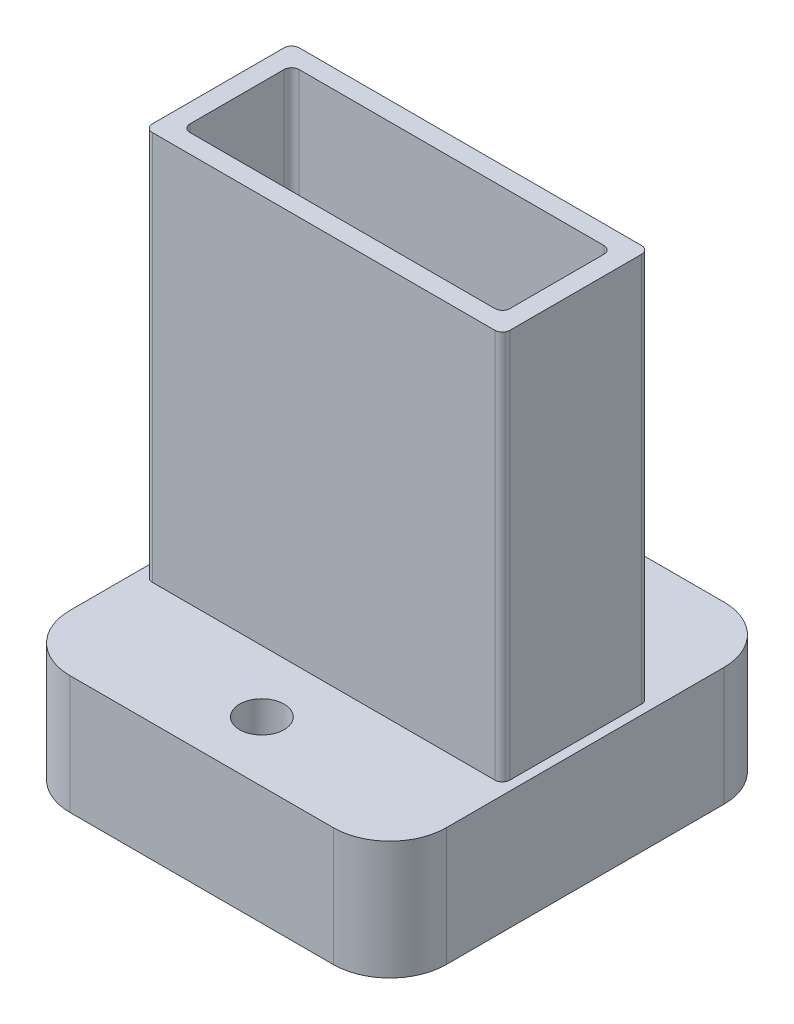
ISO-10303-21;
HEADER;
FILE_DESCRIPTION(('STEP AP214'),'2;1');
FILE_NAME('part.step','',(''),(''),'','','');
FILE_SCHEMA(('AUTOMOTIVE_DESIGN { 1 0 10303 214 1 1 1 1 }'));
ENDSEC;
DATA;
#1=APPLICATION_CONTEXT('core data for automotive mechanical design processes');
#2=APPLICATION_PROTOCOL_DEFINITION('international standard','automotive_design',2000,#1);
#3=PRODUCT_CONTEXT('',#1,'mechanical');
#4=PRODUCT('Part','Part','',(#3));
#5=PRODUCT_RELATED_PRODUCT_CATEGORY('part','',(#4));
#6=PRODUCT_DEFINITION_FORMATION('','',#4);
#7=PRODUCT_DEFINITION_CONTEXT('part definition',#1,'design');
#8=PRODUCT_DEFINITION('design','',#6,#7);
#9=PRODUCT_DEFINITION_SHAPE('','',#8);
#10=(LENGTH_UNIT() NAMED_UNIT(*) SI_UNIT(.MILLI.,.METRE.));
#11=(NAMED_UNIT(*) PLANE_ANGLE_UNIT() SI_UNIT($,.RADIAN.));
#12=(NAMED_UNIT(*) SI_UNIT($,.STERADIAN.) SOLID_ANGLE_UNIT());
#13=UNCERTAINTY_MEASURE_WITH_UNIT(LENGTH_MEASURE(1.E-05),#10,'distance_accuracy_value','');
#14=(GEOMETRIC_REPRESENTATION_CONTEXT(3) GLOBAL_UNCERTAINTY_ASSIGNED_CONTEXT((#13)) GLOBAL_UNIT_ASSIGNED_CONTEXT((#10,
#11,#12)) REPRESENTATION_CONTEXT('',''));
#15=CARTESIAN_POINT('',(0.,0.,0.));
#16=DIRECTION('',(0.,0.,1.));
#17=DIRECTION('',(1.,0.,0.));
#18=AXIS2_PLACEMENT_3D('',#15,#16,#17);
#19=CARTESIAN_POINT('',(11.557,23.622,4.445));
#20=DIRECTION('',(0.,-1.,0.));
#21=DIRECTION('',(0.,0.,-1.));
#22=AXIS2_PLACEMENT_3D('',#19,#20,#21);
#23=CYLINDRICAL_SURFACE('',#22,0.508);
#24=DIRECTION('',(0.,-1.,0.));
#25=VECTOR('',#24,1.);
#26=CARTESIAN_POINT('',(11.557,23.622,4.953));
#27=LINE('',#26,#25);
#28=CARTESIAN_POINT('',(11.557,34.29,4.953));
#29=VERTEX_POINT('',#28);
#30=CARTESIAN_POINT('',(11.557,8.,4.953));
#31=VERTEX_POINT('',#30);
#32=EDGE_CURVE('E378',#29,#31,#27,.T.);
#33=ORIENTED_EDGE('',*,*,#32,.T.);
#34=CARTESIAN_POINT('',(11.557,8.,4.445));
#35=DIRECTION('',(0.,1.,0.));
#36=DIRECTION('',(0.,0.,1.));
#37=AXIS2_PLACEMENT_3D('',#34,#35,#36);
#38=CIRCLE('',#37,0.508);
#39=CARTESIAN_POINT('',(12.065,8.,4.44499999999999));
#40=VERTEX_POINT('',#39);
#41=EDGE_CURVE('E60',#31,#40,#38,.T.);
#42=ORIENTED_EDGE('',*,*,#41,.T.);
#43=DIRECTION('',(0.,-1.,0.));
#44=VECTOR('',#43,1.);
#45=CARTESIAN_POINT('',(12.065,23.622,4.44499999999999));
#46=LINE('',#45,#44);
#47=CARTESIAN_POINT('',(12.065,34.29,4.44499999999999));
#48=VERTEX_POINT('',#47);
#49=EDGE_CURVE('E53',#48,#40,#46,.T.);
#50=ORIENTED_EDGE('',*,*,#49,.F.);
#51=CARTESIAN_POINT('',(11.557,34.29,4.445));
#52=DIRECTION('',(0.,1.,0.));
#53=DIRECTION('',(0.,0.,1.));
#54=AXIS2_PLACEMENT_3D('',#51,#52,#53);
#55=CIRCLE('',#54,0.508);
#56=EDGE_CURVE('E346',#29,#48,#55,.T.);
#57=ORIENTED_EDGE('',*,*,#56,.F.);
#58=EDGE_LOOP('',(#33,#42,#50,#57));
#59=FACE_BOUND('',#58,.T.);
#60=ADVANCED_FACE('F45',(#59),#23,.T.);
#61=CARTESIAN_POINT('',(12.065,23.622,4.44499999999999));
#62=DIRECTION('',(-1.,0.,0.));
#63=DIRECTION('',(0.,0.,1.));
#64=AXIS2_PLACEMENT_3D('',#61,#62,#63);
#65=PLANE('',#64);
#66=ORIENTED_EDGE('',*,*,#49,.T.);
#67=DIRECTION('',(0.,0.,-1.));
#68=VECTOR('',#67,1.);
#69=CARTESIAN_POINT('',(12.065,8.,4.44499999999999));
#70=LINE('',#69,#68);
#71=CARTESIAN_POINT('',(12.065,8.,-4.445));
#72=VERTEX_POINT('',#71);
#73=EDGE_CURVE('E260',#40,#72,#70,.T.);
#74=ORIENTED_EDGE('',*,*,#73,.T.);
#75=DIRECTION('',(0.,-1.,0.));
#76=VECTOR('',#75,1.);
#77=CARTESIAN_POINT('',(12.065,23.622,-4.445));
#78=LINE('',#77,#76);
#79=CARTESIAN_POINT('',(12.065,34.29,-4.445));
#80=VERTEX_POINT('',#79);
#81=EDGE_CURVE('E402',#80,#72,#78,.T.);
#82=ORIENTED_EDGE('',*,*,#81,.F.);
#83=DIRECTION('',(0.,0.,-1.));
#84=VECTOR('',#83,1.);
#85=CARTESIAN_POINT('',(12.065,34.29,4.44499999999999));
#86=LINE('',#85,#84);
#87=EDGE_CURVE('E350',#48,#80,#86,.T.);
#88=ORIENTED_EDGE('',*,*,#87,.F.);
#89=EDGE_LOOP('',(#66,#74,#82,#88));
#90=FACE_BOUND('',#89,.T.);
#91=ADVANCED_FACE('F409',(#90),#65,.F.);
#92=CARTESIAN_POINT('',(11.557,23.622,-4.445));
#93=DIRECTION('',(0.,-1.,0.));
#94=DIRECTION('',(0.,0.,-1.));
#95=AXIS2_PLACEMENT_3D('',#92,#93,#94);
#96=CYLINDRICAL_SURFACE('',#95,0.508);
#97=ORIENTED_EDGE('',*,*,#81,.T.);
#98=CARTESIAN_POINT('',(11.557,8.,-4.445));
#99=DIRECTION('',(0.,1.,0.));
#100=DIRECTION('',(0.,0.,1.));
#101=AXIS2_PLACEMENT_3D('',#98,#99,#100);
#102=CIRCLE('',#101,0.508);
#103=CARTESIAN_POINT('',(11.557,8.,-4.953));
#104=VERTEX_POINT('',#103);
#105=EDGE_CURVE('E256',#72,#104,#102,.T.);
#106=ORIENTED_EDGE('',*,*,#105,.T.);
#107=DIRECTION('',(0.,-1.,0.));
#108=VECTOR('',#107,1.);
#109=CARTESIAN_POINT('',(11.557,23.622,-4.953));
#110=LINE('',#109,#108);
#111=CARTESIAN_POINT('',(11.557,34.29,-4.953));
#112=VERTEX_POINT('',#111);
#113=EDGE_CURVE('E398',#112,#104,#110,.T.);
#114=ORIENTED_EDGE('',*,*,#113,.F.);
#115=CARTESIAN_POINT('',(11.557,34.29,-4.445));
#116=DIRECTION('',(0.,1.,0.));
#117=DIRECTION('',(0.,0.,-1.));
#118=AXIS2_PLACEMENT_3D('',#115,#116,#117);
#119=CIRCLE('',#118,0.508);
#120=EDGE_CURVE('E354',#80,#112,#119,.T.);
#121=ORIENTED_EDGE('',*,*,#120,.F.);
#122=EDGE_LOOP('',(#97,#106,#114,#121));
#123=FACE_BOUND('',#122,.T.);
#124=ADVANCED_FACE('F432',(#123),#96,.T.);
#125=CARTESIAN_POINT('',(11.557,23.622,-4.953));
#126=DIRECTION('',(0.,0.,1.));
#127=DIRECTION('',(1.,0.,0.));
#128=AXIS2_PLACEMENT_3D('',#125,#126,#127);
#129=PLANE('',#128);
#130=ORIENTED_EDGE('',*,*,#113,.T.);
#131=DIRECTION('',(-1.,0.,0.));
#132=VECTOR('',#131,1.);
#133=CARTESIAN_POINT('',(11.557,8.,-4.953));
#134=LINE('',#133,#132);
#135=CARTESIAN_POINT('',(-11.557,8.,-4.953));
#136=VERTEX_POINT('',#135);
#137=EDGE_CURVE('E252',#104,#136,#134,.T.);
#138=ORIENTED_EDGE('',*,*,#137,.T.);
#139=DIRECTION('',(0.,-1.,0.));
#140=VECTOR('',#139,1.);
#141=CARTESIAN_POINT('',(-11.557,23.622,-4.953));
#142=LINE('',#141,#140);
#143=CARTESIAN_POINT('',(-11.557,34.29,-4.953));
#144=VERTEX_POINT('',#143);
#145=EDGE_CURVE('E394',#144,#136,#142,.T.);
#146=ORIENTED_EDGE('',*,*,#145,.F.);
#147=DIRECTION('',(-1.,0.,0.));
#148=VECTOR('',#147,1.);
#149=CARTESIAN_POINT('',(11.557,34.29,-4.953));
#150=LINE('',#149,#148);
#151=EDGE_CURVE('E358',#112,#144,#150,.T.);
#152=ORIENTED_EDGE('',*,*,#151,.F.);
#153=EDGE_LOOP('',(#130,#138,#146,#152));
#154=FACE_BOUND('',#153,.T.);
#155=ADVANCED_FACE('F430',(#154),#129,.F.);
#156=CARTESIAN_POINT('',(-11.557,23.622,-4.445));
#157=DIRECTION('',(0.,-1.,0.));
#158=DIRECTION('',(0.,0.,-1.));
#159=AXIS2_PLACEMENT_3D('',#156,#157,#158);
#160=CYLINDRICAL_SURFACE('',#159,0.508);
#161=ORIENTED_EDGE('',*,*,#145,.T.);
#162=CARTESIAN_POINT('',(-11.557,8.,-4.445));
#163=DIRECTION('',(0.,1.,0.));
#164=DIRECTION('',(0.,0.,1.));
#165=AXIS2_PLACEMENT_3D('',#162,#163,#164);
#166=CIRCLE('',#165,0.508);
#167=CARTESIAN_POINT('',(-12.065,8.,-4.445));
#168=VERTEX_POINT('',#167);
#169=EDGE_CURVE('E248',#136,#168,#166,.T.);
#170=ORIENTED_EDGE('',*,*,#169,.T.);
#171=DIRECTION('',(0.,-1.,0.));
#172=VECTOR('',#171,1.);
#173=CARTESIAN_POINT('',(-12.065,23.622,-4.445));
#174=LINE('',#173,#172);
#175=CARTESIAN_POINT('',(-12.065,34.29,-4.445));
#176=VERTEX_POINT('',#175);
#177=EDGE_CURVE('E390',#176,#168,#174,.T.);
#178=ORIENTED_EDGE('',*,*,#177,.F.);
#179=CARTESIAN_POINT('',(-11.557,34.29,-4.445));
#180=DIRECTION('',(0.,1.,0.));
#181=DIRECTION('',(0.,0.,1.));
#182=AXIS2_PLACEMENT_3D('',#179,#180,#181);
#183=CIRCLE('',#182,0.508);
#184=EDGE_CURVE('E362',#144,#176,#183,.T.);
#185=ORIENTED_EDGE('',*,*,#184,.F.);
#186=EDGE_LOOP('',(#161,#170,#178,#185));
#187=FACE_BOUND('',#186,.T.);
#188=ADVANCED_FACE('F426',(#187),#160,.T.);
#189=CARTESIAN_POINT('',(-12.065,23.622,4.445));
#190=DIRECTION('',(1.,0.,0.));
#191=DIRECTION('',(0.,0.,-1.));
#192=AXIS2_PLACEMENT_3D('',#189,#190,#191);
#193=PLANE('',#192);
#194=ORIENTED_EDGE('',*,*,#177,.T.);
#195=DIRECTION('',(0.,0.,1.));
#196=VECTOR('',#195,1.);
#197=CARTESIAN_POINT('',(-12.065,8.,4.445));
#198=LINE('',#197,#196);
#199=CARTESIAN_POINT('',(-12.065,8.,4.445));
#200=VERTEX_POINT('',#199);
#201=EDGE_CURVE('E239',#168,#200,#198,.T.);
#202=ORIENTED_EDGE('',*,*,#201,.T.);
#203=DIRECTION('',(0.,-1.,0.));
#204=VECTOR('',#203,1.);
#205=CARTESIAN_POINT('',(-12.065,23.622,4.445));
#206=LINE('',#205,#204);
#207=CARTESIAN_POINT('',(-12.065,34.29,4.445));
#208=VERTEX_POINT('',#207);
#209=EDGE_CURVE('E386',#208,#200,#206,.T.);
#210=ORIENTED_EDGE('',*,*,#209,.F.);
#211=DIRECTION('',(0.,0.,1.));
#212=VECTOR('',#211,1.);
#213=CARTESIAN_POINT('',(-12.065,34.29,4.445));
#214=LINE('',#213,#212);
#215=EDGE_CURVE('E366',#176,#208,#214,.T.);
#216=ORIENTED_EDGE('',*,*,#215,.F.);
#217=EDGE_LOOP('',(#194,#202,#210,#216));
#218=FACE_BOUND('',#217,.T.);
#219=ADVANCED_FACE('F423',(#218),#193,.F.);
#220=CARTESIAN_POINT('',(-11.557,23.622,4.445));
#221=DIRECTION('',(0.,-1.,0.));
#222=DIRECTION('',(0.,0.,-1.));
#223=AXIS2_PLACEMENT_3D('',#220,#221,#222);
#224=CYLINDRICAL_SURFACE('',#223,0.508);
#225=ORIENTED_EDGE('',*,*,#209,.T.);
#226=CARTESIAN_POINT('',(-11.557,8.,4.445));
#227=DIRECTION('',(0.,1.,0.));
#228=DIRECTION('',(0.,0.,1.));
#229=AXIS2_PLACEMENT_3D('',#226,#227,#228);
#230=CIRCLE('',#229,0.508);
#231=CARTESIAN_POINT('',(-11.557,8.,4.953));
#232=VERTEX_POINT('',#231);
#233=EDGE_CURVE('E234',#200,#232,#230,.T.);
#234=ORIENTED_EDGE('',*,*,#233,.T.);
#235=DIRECTION('',(0.,-1.,0.));
#236=VECTOR('',#235,1.);
#237=CARTESIAN_POINT('',(-11.557,23.622,4.953));
#238=LINE('',#237,#236);
#239=CARTESIAN_POINT('',(-11.557,34.29,4.953));
#240=VERTEX_POINT('',#239);
#241=EDGE_CURVE('E382',#240,#232,#238,.T.);
#242=ORIENTED_EDGE('',*,*,#241,.F.);
#243=CARTESIAN_POINT('',(-11.557,34.29,4.445));
#244=DIRECTION('',(0.,1.,0.));
#245=DIRECTION('',(0.,0.,1.));
#246=AXIS2_PLACEMENT_3D('',#243,#244,#245);
#247=CIRCLE('',#246,0.508);
#248=EDGE_CURVE('E370',#208,#240,#247,.T.);
#249=ORIENTED_EDGE('',*,*,#248,.F.);
#250=EDGE_LOOP('',(#225,#234,#242,#249));
#251=FACE_BOUND('',#250,.T.);
#252=ADVANCED_FACE('F421',(#251),#224,.T.);
#253=CARTESIAN_POINT('',(11.557,23.622,4.953));
#254=DIRECTION('',(0.,0.,-1.));
#255=DIRECTION('',(-1.,0.,0.));
#256=AXIS2_PLACEMENT_3D('',#253,#254,#255);
#257=PLANE('',#256);
#258=ORIENTED_EDGE('',*,*,#241,.T.);
#259=DIRECTION('',(1.,0.,0.));
#260=VECTOR('',#259,1.);
#261=CARTESIAN_POINT('',(11.557,8.,4.953));
#262=LINE('',#261,#260);
#263=EDGE_CURVE('E11',#232,#31,#262,.T.);
#264=ORIENTED_EDGE('',*,*,#263,.T.);
#265=ORIENTED_EDGE('',*,*,#32,.F.);
#266=DIRECTION('',(1.,0.,0.));
#267=VECTOR('',#266,1.);
#268=CARTESIAN_POINT('',(11.557,34.29,4.953));
#269=LINE('',#268,#267);
#270=EDGE_CURVE('E374',#240,#29,#269,.T.);
#271=ORIENTED_EDGE('',*,*,#270,.F.);
#272=EDGE_LOOP('',(#258,#264,#265,#271));
#273=FACE_BOUND('',#272,.T.);
#274=ADVANCED_FACE('F414',(#273),#257,.F.);
#275=CARTESIAN_POINT('',(11.557,34.29,4.445));
#276=DIRECTION('',(0.,1.,0.));
#277=DIRECTION('',(0.,0.,1.));
#278=AXIS2_PLACEMENT_3D('',#275,#276,#277);
#279=PLANE('',#278);
#280=ORIENTED_EDGE('',*,*,#56,.T.);
#281=ORIENTED_EDGE('',*,*,#87,.T.);
#282=ORIENTED_EDGE('',*,*,#120,.T.);
#283=ORIENTED_EDGE('',*,*,#151,.T.);
#284=ORIENTED_EDGE('',*,*,#184,.T.);
#285=ORIENTED_EDGE('',*,*,#215,.T.);
#286=ORIENTED_EDGE('',*,*,#248,.T.);
#287=ORIENTED_EDGE('',*,*,#270,.T.);
#288=EDGE_LOOP('',(#280,#281,#282,#283,#284,#285,#286,#287));
#289=FACE_BOUND('',#288,.T.);
#290=DIRECTION('',(0.,0.,-1.));
#291=VECTOR('',#290,1.);
#292=CARTESIAN_POINT('',(10.795,34.29,3.17499999999999));
#293=LINE('',#292,#291);
#294=CARTESIAN_POINT('',(10.795,34.29,3.17499999999999));
#295=VERTEX_POINT('',#294);
#296=CARTESIAN_POINT('',(10.795,34.29,-3.175));
#297=VERTEX_POINT('',#296);
#298=EDGE_CURVE('E269',#295,#297,#293,.T.);
#299=ORIENTED_EDGE('',*,*,#298,.F.);
#300=CARTESIAN_POINT('',(10.287,34.29,3.175));
#301=DIRECTION('',(0.,1.,0.));
#302=DIRECTION('',(0.,0.,1.));
#303=AXIS2_PLACEMENT_3D('',#300,#301,#302);
#304=CIRCLE('',#303,0.508);
#305=CARTESIAN_POINT('',(10.287,34.29,3.683));
#306=VERTEX_POINT('',#305);
#307=EDGE_CURVE('E266',#306,#295,#304,.T.);
#308=ORIENTED_EDGE('',*,*,#307,.F.);
#309=DIRECTION('',(1.,0.,0.));
#310=VECTOR('',#309,1.);
#311=CARTESIAN_POINT('',(10.287,34.29,3.683));
#312=LINE('',#311,#310);
#313=CARTESIAN_POINT('',(-10.287,34.29,3.683));
#314=VERTEX_POINT('',#313);
#315=EDGE_CURVE('E289',#314,#306,#312,.T.);
#316=ORIENTED_EDGE('',*,*,#315,.F.);
#317=CARTESIAN_POINT('',(-10.287,34.29,3.175));
#318=DIRECTION('',(0.,1.,0.));
#319=DIRECTION('',(0.,0.,-1.));
#320=AXIS2_PLACEMENT_3D('',#317,#318,#319);
#321=CIRCLE('',#320,0.508);
#322=CARTESIAN_POINT('',(-10.795,34.29,3.175));
#323=VERTEX_POINT('',#322);
#324=EDGE_CURVE('E285',#323,#314,#321,.T.);
#325=ORIENTED_EDGE('',*,*,#324,.F.);
#326=DIRECTION('',(0.,0.,1.));
#327=VECTOR('',#326,1.);
#328=CARTESIAN_POINT('',(-10.795,34.29,3.175));
#329=LINE('',#328,#327);
#330=CARTESIAN_POINT('',(-10.795,34.29,-3.17499999999999));
#331=VERTEX_POINT('',#330);
#332=EDGE_CURVE('E282',#331,#323,#329,.T.);
#333=ORIENTED_EDGE('',*,*,#332,.F.);
#334=CARTESIAN_POINT('',(-10.287,34.29,-3.175));
#335=DIRECTION('',(0.,1.,0.));
#336=DIRECTION('',(0.,0.,1.));
#337=AXIS2_PLACEMENT_3D('',#334,#335,#336);
#338=CIRCLE('',#337,0.508);
#339=CARTESIAN_POINT('',(-10.287,34.29,-3.683));
#340=VERTEX_POINT('',#339);
#341=EDGE_CURVE('E279',#340,#331,#338,.T.);
#342=ORIENTED_EDGE('',*,*,#341,.F.);
#343=DIRECTION('',(-1.,0.,0.));
#344=VECTOR('',#343,1.);
#345=CARTESIAN_POINT('',(10.287,34.29,-3.683));
#346=LINE('',#345,#344);
#347=CARTESIAN_POINT('',(10.287,34.29,-3.683));
#348=VERTEX_POINT('',#347);
#349=EDGE_CURVE('E276',#348,#340,#346,.T.);
#350=ORIENTED_EDGE('',*,*,#349,.F.);
#351=CARTESIAN_POINT('',(10.287,34.29,-3.175));
#352=DIRECTION('',(0.,1.,0.));
#353=DIRECTION('',(0.,0.,1.));
#354=AXIS2_PLACEMENT_3D('',#351,#352,#353);
#355=CIRCLE('',#354,0.508);
#356=EDGE_CURVE('E273',#297,#348,#355,.T.);
#357=ORIENTED_EDGE('',*,*,#356,.F.);
#358=EDGE_LOOP('',(#299,#308,#316,#325,#333,#342,#350,#357));
#359=FACE_BOUND('',#358,.T.);
#360=ADVANCED_FACE('F416',(#289,#359),#279,.T.);
#361=CARTESIAN_POINT('',(10.287,34.29,3.175));
#362=DIRECTION('',(0.,-1.,0.));
#363=DIRECTION('',(0.,0.,-1.));
#364=AXIS2_PLACEMENT_3D('',#361,#362,#363);
#365=CYLINDRICAL_SURFACE('',#364,0.508);
#366=CARTESIAN_POINT('',(10.287,23.622,3.175));
#367=DIRECTION('',(0.,1.,0.));
#368=DIRECTION('',(0.,0.,1.));
#369=AXIS2_PLACEMENT_3D('',#366,#367,#368);
#370=CIRCLE('',#369,0.508);
#371=CARTESIAN_POINT('',(10.287,23.622,3.683));
#372=VERTEX_POINT('',#371);
#373=CARTESIAN_POINT('',(10.795,23.622,3.17499999999999));
#374=VERTEX_POINT('',#373);
#375=EDGE_CURVE('E67',#372,#374,#370,.T.);
#376=ORIENTED_EDGE('',*,*,#375,.F.);
#377=DIRECTION('',(0.,-1.,0.));
#378=VECTOR('',#377,1.);
#379=CARTESIAN_POINT('',(10.287,34.29,3.683));
#380=LINE('',#379,#378);
#381=EDGE_CURVE('E292',#306,#372,#380,.T.);
#382=ORIENTED_EDGE('',*,*,#381,.F.);
#383=ORIENTED_EDGE('',*,*,#307,.T.);
#384=DIRECTION('',(0.,-1.,0.));
#385=VECTOR('',#384,1.);
#386=CARTESIAN_POINT('',(10.795,34.29,3.17499999999999));
#387=LINE('',#386,#385);
#388=EDGE_CURVE('E342',#295,#374,#387,.T.);
#389=ORIENTED_EDGE('',*,*,#388,.T.);
#390=EDGE_LOOP('',(#376,#382,#383,#389));
#391=FACE_BOUND('',#390,.T.);
#392=ADVANCED_FACE('F521',(#391),#365,.F.);
#393=CARTESIAN_POINT('',(10.795,34.29,3.17499999999999));
#394=DIRECTION('',(-1.,0.,0.));
#395=DIRECTION('',(0.,0.,1.));
#396=AXIS2_PLACEMENT_3D('',#393,#394,#395);
#397=PLANE('',#396);
#398=DIRECTION('',(0.,0.,-1.));
#399=VECTOR('',#398,1.);
#400=CARTESIAN_POINT('',(10.795,23.622,3.17499999999999));
#401=LINE('',#400,#399);
#402=CARTESIAN_POINT('',(10.795,23.622,-3.175));
#403=VERTEX_POINT('',#402);
#404=EDGE_CURVE('E295',#374,#403,#401,.T.);
#405=ORIENTED_EDGE('',*,*,#404,.F.);
#406=ORIENTED_EDGE('',*,*,#388,.F.);
#407=ORIENTED_EDGE('',*,*,#298,.T.);
#408=DIRECTION('',(0.,-1.,0.));
#409=VECTOR('',#408,1.);
#410=CARTESIAN_POINT('',(10.795,34.29,-3.175));
#411=LINE('',#410,#409);
#412=EDGE_CURVE('E338',#297,#403,#411,.T.);
#413=ORIENTED_EDGE('',*,*,#412,.T.);
#414=EDGE_LOOP('',(#405,#406,#407,#413));
#415=FACE_BOUND('',#414,.T.);
#416=ADVANCED_FACE('F531',(#415),#397,.T.);
#417=CARTESIAN_POINT('',(10.287,34.29,-3.175));
#418=DIRECTION('',(0.,-1.,0.));
#419=DIRECTION('',(0.,0.,-1.));
#420=AXIS2_PLACEMENT_3D('',#417,#418,#419);
#421=CYLINDRICAL_SURFACE('',#420,0.508);
#422=CARTESIAN_POINT('',(10.287,23.622,-3.175));
#423=DIRECTION('',(0.,1.,0.));
#424=DIRECTION('',(0.,0.,1.));
#425=AXIS2_PLACEMENT_3D('',#422,#423,#424);
#426=CIRCLE('',#425,0.508);
#427=CARTESIAN_POINT('',(10.287,23.622,-3.683));
#428=VERTEX_POINT('',#427);
#429=EDGE_CURVE('E298',#403,#428,#426,.T.);
#430=ORIENTED_EDGE('',*,*,#429,.F.);
#431=ORIENTED_EDGE('',*,*,#412,.F.);
#432=ORIENTED_EDGE('',*,*,#356,.T.);
#433=DIRECTION('',(0.,-1.,0.));
#434=VECTOR('',#433,1.);
#435=CARTESIAN_POINT('',(10.287,34.29,-3.683));
#436=LINE('',#435,#434);
#437=EDGE_CURVE('E334',#348,#428,#436,.T.);
#438=ORIENTED_EDGE('',*,*,#437,.T.);
#439=EDGE_LOOP('',(#430,#431,#432,#438));
#440=FACE_BOUND('',#439,.T.);
#441=ADVANCED_FACE('F541',(#440),#421,.F.);
#442=CARTESIAN_POINT('',(10.287,34.29,-3.683));
#443=DIRECTION('',(0.,0.,1.));
#444=DIRECTION('',(1.,0.,0.));
#445=AXIS2_PLACEMENT_3D('',#442,#443,#444);
#446=PLANE('',#445);
#447=DIRECTION('',(-1.,0.,0.));
#448=VECTOR('',#447,1.);
#449=CARTESIAN_POINT('',(10.287,23.622,-3.683));
#450=LINE('',#449,#448);
#451=CARTESIAN_POINT('',(-10.287,23.622,-3.683));
#452=VERTEX_POINT('',#451);
#453=EDGE_CURVE('E301',#428,#452,#450,.T.);
#454=ORIENTED_EDGE('',*,*,#453,.F.);
#455=ORIENTED_EDGE('',*,*,#437,.F.);
#456=ORIENTED_EDGE('',*,*,#349,.T.);
#457=DIRECTION('',(0.,-1.,0.));
#458=VECTOR('',#457,1.);
#459=CARTESIAN_POINT('',(-10.287,34.29,-3.683));
#460=LINE('',#459,#458);
#461=EDGE_CURVE('E330',#340,#452,#460,.T.);
#462=ORIENTED_EDGE('',*,*,#461,.T.);
#463=EDGE_LOOP('',(#454,#455,#456,#462));
#464=FACE_BOUND('',#463,.T.);
#465=ADVANCED_FACE('F551',(#464),#446,.T.);
#466=CARTESIAN_POINT('',(-10.287,34.29,-3.175));
#467=DIRECTION('',(0.,-1.,0.));
#468=DIRECTION('',(0.,0.,-1.));
#469=AXIS2_PLACEMENT_3D('',#466,#467,#468);
#470=CYLINDRICAL_SURFACE('',#469,0.508);
#471=CARTESIAN_POINT('',(-10.287,23.622,-3.175));
#472=DIRECTION('',(0.,1.,0.));
#473=DIRECTION('',(0.,0.,1.));
#474=AXIS2_PLACEMENT_3D('',#471,#472,#473);
#475=CIRCLE('',#474,0.508);
#476=CARTESIAN_POINT('',(-10.795,23.622,-3.175));
#477=VERTEX_POINT('',#476);
#478=EDGE_CURVE('E304',#452,#477,#475,.T.);
#479=ORIENTED_EDGE('',*,*,#478,.F.);
#480=ORIENTED_EDGE('',*,*,#461,.F.);
#481=ORIENTED_EDGE('',*,*,#341,.T.);
#482=DIRECTION('',(0.,-1.,0.));
#483=VECTOR('',#482,1.);
#484=CARTESIAN_POINT('',(-10.795,34.29,-3.17499999999999));
#485=LINE('',#484,#483);
#486=EDGE_CURVE('E326',#331,#477,#485,.T.);
#487=ORIENTED_EDGE('',*,*,#486,.T.);
#488=EDGE_LOOP('',(#479,#480,#481,#487));
#489=FACE_BOUND('',#488,.T.);
#490=ADVANCED_FACE('F561',(#489),#470,.F.);
#491=CARTESIAN_POINT('',(-10.795,34.29,3.175));
#492=DIRECTION('',(1.,0.,0.));
#493=DIRECTION('',(0.,0.,-1.));
#494=AXIS2_PLACEMENT_3D('',#491,#492,#493);
#495=PLANE('',#494);
#496=DIRECTION('',(0.,0.,1.));
#497=VECTOR('',#496,1.);
#498=CARTESIAN_POINT('',(-10.795,23.622,3.175));
#499=LINE('',#498,#497);
#500=CARTESIAN_POINT('',(-10.795,23.622,3.175));
#501=VERTEX_POINT('',#500);
#502=EDGE_CURVE('E307',#477,#501,#499,.T.);
#503=ORIENTED_EDGE('',*,*,#502,.F.);
#504=ORIENTED_EDGE('',*,*,#486,.F.);
#505=ORIENTED_EDGE('',*,*,#332,.T.);
#506=DIRECTION('',(0.,-1.,0.));
#507=VECTOR('',#506,1.);
#508=CARTESIAN_POINT('',(-10.795,34.29,3.175));
#509=LINE('',#508,#507);
#510=EDGE_CURVE('E322',#323,#501,#509,.T.);
#511=ORIENTED_EDGE('',*,*,#510,.T.);
#512=EDGE_LOOP('',(#503,#504,#505,#511));
#513=FACE_BOUND('',#512,.T.);
#514=ADVANCED_FACE('F571',(#513),#495,.T.);
#515=CARTESIAN_POINT('',(-10.287,34.29,3.175));
#516=DIRECTION('',(0.,-1.,0.));
#517=DIRECTION('',(0.,0.,-1.));
#518=AXIS2_PLACEMENT_3D('',#515,#516,#517);
#519=CYLINDRICAL_SURFACE('',#518,0.508);
#520=CARTESIAN_POINT('',(-10.287,23.622,3.175));
#521=DIRECTION('',(0.,1.,0.));
#522=DIRECTION('',(0.,0.,-1.));
#523=AXIS2_PLACEMENT_3D('',#520,#521,#522);
#524=CIRCLE('',#523,0.508);
#525=CARTESIAN_POINT('',(-10.287,23.622,3.683));
#526=VERTEX_POINT('',#525);
#527=EDGE_CURVE('E310',#501,#526,#524,.T.);
#528=ORIENTED_EDGE('',*,*,#527,.F.);
#529=ORIENTED_EDGE('',*,*,#510,.F.);
#530=ORIENTED_EDGE('',*,*,#324,.T.);
#531=DIRECTION('',(0.,-1.,0.));
#532=VECTOR('',#531,1.);
#533=CARTESIAN_POINT('',(-10.287,34.29,3.683));
#534=LINE('',#533,#532);
#535=EDGE_CURVE('E318',#314,#526,#534,.T.);
#536=ORIENTED_EDGE('',*,*,#535,.T.);
#537=EDGE_LOOP('',(#528,#529,#530,#536));
#538=FACE_BOUND('',#537,.T.);
#539=ADVANCED_FACE('F581',(#538),#519,.F.);
#540=CARTESIAN_POINT('',(10.287,34.29,3.683));
#541=DIRECTION('',(0.,0.,-1.));
#542=DIRECTION('',(-1.,0.,0.));
#543=AXIS2_PLACEMENT_3D('',#540,#541,#542);
#544=PLANE('',#543);
#545=DIRECTION('',(1.,0.,0.));
#546=VECTOR('',#545,1.);
#547=CARTESIAN_POINT('',(10.287,23.622,3.683));
#548=LINE('',#547,#546);
#549=EDGE_CURVE('E270',#526,#372,#548,.T.);
#550=ORIENTED_EDGE('',*,*,#549,.F.);
#551=ORIENTED_EDGE('',*,*,#535,.F.);
#552=ORIENTED_EDGE('',*,*,#315,.T.);
#553=ORIENTED_EDGE('',*,*,#381,.T.);
#554=EDGE_LOOP('',(#550,#551,#552,#553));
#555=FACE_BOUND('',#554,.T.);
#556=ADVANCED_FACE('F591',(#555),#544,.T.);
#557=CARTESIAN_POINT('',(11.557,23.622,4.445));
#558=DIRECTION('',(0.,1.,0.));
#559=DIRECTION('',(0.,0.,1.));
#560=AXIS2_PLACEMENT_3D('',#557,#558,#559);
#561=PLANE('',#560);
#562=ORIENTED_EDGE('',*,*,#375,.T.);
#563=ORIENTED_EDGE('',*,*,#404,.T.);
#564=ORIENTED_EDGE('',*,*,#429,.T.);
#565=ORIENTED_EDGE('',*,*,#453,.T.);
#566=ORIENTED_EDGE('',*,*,#478,.T.);
#567=ORIENTED_EDGE('',*,*,#502,.T.);
#568=ORIENTED_EDGE('',*,*,#527,.T.);
#569=ORIENTED_EDGE('',*,*,#549,.T.);
#570=EDGE_LOOP('',(#562,#563,#564,#565,#566,#567,#568,#569));
#571=FACE_BOUND('',#570,.T.);
#572=ADVANCED_FACE('F449',(#571),#561,.T.);
#573=CARTESIAN_POINT('',(8.89,8.,9.374));
#574=DIRECTION('',(0.,1.,0.));
#575=DIRECTION('',(0.,0.,1.));
#576=AXIS2_PLACEMENT_3D('',#573,#574,#575);
#577=PLANE('',#576);
#578=CARTESIAN_POINT('',(0.,8.,-9.12));
#579=DIRECTION('',(0.,1.,0.));
#580=DIRECTION('',(0.,0.,-1.));
#581=AXIS2_PLACEMENT_3D('',#578,#579,#580);
#582=CIRCLE('',#581,1.499997);
#583=CARTESIAN_POINT('',(0.,8.,-10.619997));
#584=VERTEX_POINT('',#583);
#585=EDGE_CURVE('E751',#584,#584,#582,.T.);
#586=ORIENTED_EDGE('',*,*,#585,.F.);
#587=EDGE_LOOP('',(#586));
#588=FACE_BOUND('',#587,.T.);
#589=CARTESIAN_POINT('',(8.89,8.,9.374));
#590=DIRECTION('',(0.,1.,0.));
#591=DIRECTION('',(0.,0.,1.));
#592=AXIS2_PLACEMENT_3D('',#589,#590,#591);
#593=CIRCLE('',#592,3.81);
#594=CARTESIAN_POINT('',(8.89,8.,13.184));
#595=VERTEX_POINT('',#594);
#596=CARTESIAN_POINT('',(12.7,8.,9.374));
#597=VERTEX_POINT('',#596);
#598=EDGE_CURVE('E217',#595,#597,#593,.T.);
#599=ORIENTED_EDGE('',*,*,#598,.T.);
#600=DIRECTION('',(0.,0.,-1.));
#601=VECTOR('',#600,1.);
#602=CARTESIAN_POINT('',(12.7,8.,-9.374));
#603=LINE('',#602,#601);
#604=CARTESIAN_POINT('',(12.7,8.,-9.374));
#605=VERTEX_POINT('',#604);
#606=EDGE_CURVE('E205',#597,#605,#603,.T.);
#607=ORIENTED_EDGE('',*,*,#606,.T.);
#608=CARTESIAN_POINT('',(8.89,8.,-9.374));
#609=DIRECTION('',(0.,1.,0.));
#610=DIRECTION('',(0.,0.,-1.));
#611=AXIS2_PLACEMENT_3D('',#608,#609,#610);
#612=CIRCLE('',#611,3.81);
#613=CARTESIAN_POINT('',(8.89,8.,-13.184));
#614=VERTEX_POINT('',#613);
#615=EDGE_CURVE('E216',#605,#614,#612,.T.);
#616=ORIENTED_EDGE('',*,*,#615,.T.);
#617=DIRECTION('',(-1.,0.,0.));
#618=VECTOR('',#617,1.);
#619=CARTESIAN_POINT('',(-8.89,8.,-13.184));
#620=LINE('',#619,#618);
#621=CARTESIAN_POINT('',(-8.89,8.,-13.184));
#622=VERTEX_POINT('',#621);
#623=EDGE_CURVE('E765',#614,#622,#620,.T.);
#624=ORIENTED_EDGE('',*,*,#623,.T.);
#625=CARTESIAN_POINT('',(-8.89,8.,-9.374));
#626=DIRECTION('',(0.,1.,0.));
#627=DIRECTION('',(0.,0.,-1.));
#628=AXIS2_PLACEMENT_3D('',#625,#626,#627);
#629=CIRCLE('',#628,3.81);
#630=CARTESIAN_POINT('',(-12.7,8.,-9.374));
#631=VERTEX_POINT('',#630);
#632=EDGE_CURVE('E768',#622,#631,#629,.T.);
#633=ORIENTED_EDGE('',*,*,#632,.T.);
#634=DIRECTION('',(0.,0.,1.));
#635=VECTOR('',#634,1.);
#636=CARTESIAN_POINT('',(-12.7,8.,-9.374));
#637=LINE('',#636,#635);
#638=CARTESIAN_POINT('',(-12.7,8.,9.374));
#639=VERTEX_POINT('',#638);
#640=EDGE_CURVE('E771',#631,#639,#637,.T.);
#641=ORIENTED_EDGE('',*,*,#640,.T.);
#642=CARTESIAN_POINT('',(-8.89,8.,9.374));
#643=DIRECTION('',(0.,1.,0.));
#644=DIRECTION('',(0.,0.,1.));
#645=AXIS2_PLACEMENT_3D('',#642,#643,#644);
#646=CIRCLE('',#645,3.81);
#647=CARTESIAN_POINT('',(-8.89,8.,13.184));
#648=VERTEX_POINT('',#647);
#649=EDGE_CURVE('E774',#639,#648,#646,.T.);
#650=ORIENTED_EDGE('',*,*,#649,.T.);
#651=DIRECTION('',(1.,0.,0.));
#652=VECTOR('',#651,1.);
#653=CARTESIAN_POINT('',(-8.89,8.,13.184));
#654=LINE('',#653,#652);
#655=EDGE_CURVE('E223',#648,#595,#654,.T.);
#656=ORIENTED_EDGE('',*,*,#655,.T.);
#657=EDGE_LOOP('',(#599,#607,#616,#624,#633,#641,#650,#656));
#658=FACE_BOUND('',#657,.T.);
#659=CARTESIAN_POINT('',(0.,8.,9.12));
#660=DIRECTION('',(0.,1.,0.));
#661=DIRECTION('',(0.,0.,1.));
#662=AXIS2_PLACEMENT_3D('',#659,#660,#661);
#663=CIRCLE('',#662,1.499997);
#664=CARTESIAN_POINT('',(0.,8.,10.619997));
#665=VERTEX_POINT('',#664);
#666=EDGE_CURVE('E757',#665,#665,#663,.T.);
#667=ORIENTED_EDGE('',*,*,#666,.F.);
#668=EDGE_LOOP('',(#667));
#669=FACE_BOUND('',#668,.T.);
#670=ORIENTED_EDGE('',*,*,#41,.F.);
#671=ORIENTED_EDGE('',*,*,#263,.F.);
#672=ORIENTED_EDGE('',*,*,#233,.F.);
#673=ORIENTED_EDGE('',*,*,#201,.F.);
#674=ORIENTED_EDGE('',*,*,#169,.F.);
#675=ORIENTED_EDGE('',*,*,#137,.F.);
#676=ORIENTED_EDGE('',*,*,#105,.F.);
#677=ORIENTED_EDGE('',*,*,#73,.F.);
#678=EDGE_LOOP('',(#670,#671,#672,#673,#674,#675,#676,#677));
#679=FACE_BOUND('',#678,.T.);
#680=ADVANCED_FACE('F220',(#588,#658,#669,#679),#577,.T.);
#681=CARTESIAN_POINT('',(8.89,8.,9.374));
#682=DIRECTION('',(0.,-1.,0.));
#683=DIRECTION('',(0.,0.,-1.));
#684=AXIS2_PLACEMENT_3D('',#681,#682,#683);
#685=CYLINDRICAL_SURFACE('',#684,3.81);
#686=CARTESIAN_POINT('',(8.89,0.,9.374));
#687=DIRECTION('',(0.,1.,0.));
#688=DIRECTION('',(0.,0.,1.));
#689=AXIS2_PLACEMENT_3D('',#686,#687,#688);
#690=CIRCLE('',#689,3.81);
#691=CARTESIAN_POINT('',(8.89,0.,13.184));
#692=VERTEX_POINT('',#691);
#693=CARTESIAN_POINT('',(12.7,0.,9.374));
#694=VERTEX_POINT('',#693);
#695=EDGE_CURVE('E232',#692,#694,#690,.T.);
#696=ORIENTED_EDGE('',*,*,#695,.T.);
#697=DIRECTION('',(0.,-1.,0.));
#698=VECTOR('',#697,1.);
#699=CARTESIAN_POINT('',(12.7,8.,9.374));
#700=LINE('',#699,#698);
#701=EDGE_CURVE('E209',#597,#694,#700,.T.);
#702=ORIENTED_EDGE('',*,*,#701,.F.);
#703=ORIENTED_EDGE('',*,*,#598,.F.);
#704=DIRECTION('',(0.,-1.,0.));
#705=VECTOR('',#704,1.);
#706=CARTESIAN_POINT('',(8.89,8.,13.184));
#707=LINE('',#706,#705);
#708=EDGE_CURVE('E779',#595,#692,#707,.T.);
#709=ORIENTED_EDGE('',*,*,#708,.T.);
#710=EDGE_LOOP('',(#696,#702,#703,#709));
#711=FACE_BOUND('',#710,.T.);
#712=ADVANCED_FACE('F230',(#711),#685,.T.);
#713=CARTESIAN_POINT('',(12.7,8.,-9.374));
#714=DIRECTION('',(-1.,0.,0.));
#715=DIRECTION('',(0.,0.,1.));
#716=AXIS2_PLACEMENT_3D('',#713,#714,#715);
#717=PLANE('',#716);
#718=DIRECTION('',(0.,0.,-1.));
#719=VECTOR('',#718,1.);
#720=CARTESIAN_POINT('',(12.7,0.,-9.374));
#721=LINE('',#720,#719);
#722=CARTESIAN_POINT('',(12.7,0.,-9.374));
#723=VERTEX_POINT('',#722);
#724=EDGE_CURVE('E782',#694,#723,#721,.T.);
#725=ORIENTED_EDGE('',*,*,#724,.T.);
#726=DIRECTION('',(0.,-1.,0.));
#727=VECTOR('',#726,1.);
#728=CARTESIAN_POINT('',(12.7,8.,-9.374));
#729=LINE('',#728,#727);
#730=EDGE_CURVE('E212',#605,#723,#729,.T.);
#731=ORIENTED_EDGE('',*,*,#730,.F.);
#732=ORIENTED_EDGE('',*,*,#606,.F.);
#733=ORIENTED_EDGE('',*,*,#701,.T.);
#734=EDGE_LOOP('',(#725,#731,#732,#733));
#735=FACE_BOUND('',#734,.T.);
#736=ADVANCED_FACE('F207',(#735),#717,.F.);
#737=CARTESIAN_POINT('',(8.89,8.,-9.374));
#738=DIRECTION('',(0.,-1.,0.));
#739=DIRECTION('',(0.,0.,-1.));
#740=AXIS2_PLACEMENT_3D('',#737,#738,#739);
#741=CYLINDRICAL_SURFACE('',#740,3.81);
#742=CARTESIAN_POINT('',(8.89,0.,-9.374));
#743=DIRECTION('',(0.,1.,0.));
#744=DIRECTION('',(0.,0.,-1.));
#745=AXIS2_PLACEMENT_3D('',#742,#743,#744);
#746=CIRCLE('',#745,3.81);
#747=CARTESIAN_POINT('',(8.89,0.,-13.184));
#748=VERTEX_POINT('',#747);
#749=EDGE_CURVE('E785',#723,#748,#746,.T.);
#750=ORIENTED_EDGE('',*,*,#749,.T.);
#751=DIRECTION('',(0.,-1.,0.));
#752=VECTOR('',#751,1.);
#753=CARTESIAN_POINT('',(8.89,8.,-13.184));
#754=LINE('',#753,#752);
#755=EDGE_CURVE('E241',#614,#748,#754,.T.);
#756=ORIENTED_EDGE('',*,*,#755,.F.);
#757=ORIENTED_EDGE('',*,*,#615,.F.);
#758=ORIENTED_EDGE('',*,*,#730,.T.);
#759=EDGE_LOOP('',(#750,#756,#757,#758));
#760=FACE_BOUND('',#759,.T.);
#761=ADVANCED_FACE('F628',(#760),#741,.T.);
#762=CARTESIAN_POINT('',(-8.89,8.,-13.184));
#763=DIRECTION('',(0.,0.,1.));
#764=DIRECTION('',(1.,0.,0.));
#765=AXIS2_PLACEMENT_3D('',#762,#763,#764);
#766=PLANE('',#765);
#767=DIRECTION('',(-1.,0.,0.));
#768=VECTOR('',#767,1.);
#769=CARTESIAN_POINT('',(-8.89,0.,-13.184));
#770=LINE('',#769,#768);
#771=CARTESIAN_POINT('',(-8.89,0.,-13.184));
#772=VERTEX_POINT('',#771);
#773=EDGE_CURVE('E788',#748,#772,#770,.T.);
#774=ORIENTED_EDGE('',*,*,#773,.T.);
#775=DIRECTION('',(0.,-1.,0.));
#776=VECTOR('',#775,1.);
#777=CARTESIAN_POINT('',(-8.89,8.,-13.184));
#778=LINE('',#777,#776);
#779=EDGE_CURVE('E816',#622,#772,#778,.T.);
#780=ORIENTED_EDGE('',*,*,#779,.F.);
#781=ORIENTED_EDGE('',*,*,#623,.F.);
#782=ORIENTED_EDGE('',*,*,#755,.T.);
#783=EDGE_LOOP('',(#774,#780,#781,#782));
#784=FACE_BOUND('',#783,.T.);
#785=ADVANCED_FACE('F637',(#784),#766,.F.);
#786=CARTESIAN_POINT('',(-8.89,8.,-9.374));
#787=DIRECTION('',(0.,-1.,0.));
#788=DIRECTION('',(0.,0.,-1.));
#789=AXIS2_PLACEMENT_3D('',#786,#787,#788);
#790=CYLINDRICAL_SURFACE('',#789,3.81);
#791=CARTESIAN_POINT('',(-8.89,0.,-9.374));
#792=DIRECTION('',(0.,1.,0.));
#793=DIRECTION('',(0.,0.,-1.));
#794=AXIS2_PLACEMENT_3D('',#791,#792,#793);
#795=CIRCLE('',#794,3.81);
#796=CARTESIAN_POINT('',(-12.7,0.,-9.374));
#797=VERTEX_POINT('',#796);
#798=EDGE_CURVE('E791',#772,#797,#795,.T.);
#799=ORIENTED_EDGE('',*,*,#798,.T.);
#800=DIRECTION('',(0.,-1.,0.));
#801=VECTOR('',#800,1.);
#802=CARTESIAN_POINT('',(-12.7,8.,-9.374));
#803=LINE('',#802,#801);
#804=EDGE_CURVE('E812',#631,#797,#803,.T.);
#805=ORIENTED_EDGE('',*,*,#804,.F.);
#806=ORIENTED_EDGE('',*,*,#632,.F.);
#807=ORIENTED_EDGE('',*,*,#779,.T.);
#808=EDGE_LOOP('',(#799,#805,#806,#807));
#809=FACE_BOUND('',#808,.T.);
#810=ADVANCED_FACE('F647',(#809),#790,.T.);
#811=CARTESIAN_POINT('',(-12.7,8.,-9.374));
#812=DIRECTION('',(1.,0.,0.));
#813=DIRECTION('',(0.,0.,-1.));
#814=AXIS2_PLACEMENT_3D('',#811,#812,#813);
#815=PLANE('',#814);
#816=DIRECTION('',(0.,0.,1.));
#817=VECTOR('',#816,1.);
#818=CARTESIAN_POINT('',(-12.7,0.,-9.374));
#819=LINE('',#818,#817);
#820=CARTESIAN_POINT('',(-12.7,0.,9.374));
#821=VERTEX_POINT('',#820);
#822=EDGE_CURVE('E794',#797,#821,#819,.T.);
#823=ORIENTED_EDGE('',*,*,#822,.T.);
#824=DIRECTION('',(0.,-1.,0.));
#825=VECTOR('',#824,1.);
#826=CARTESIAN_POINT('',(-12.7,8.,9.374));
#827=LINE('',#826,#825);
#828=EDGE_CURVE('E808',#639,#821,#827,.T.);
#829=ORIENTED_EDGE('',*,*,#828,.F.);
#830=ORIENTED_EDGE('',*,*,#640,.F.);
#831=ORIENTED_EDGE('',*,*,#804,.T.);
#832=EDGE_LOOP('',(#823,#829,#830,#831));
#833=FACE_BOUND('',#832,.T.);
#834=ADVANCED_FACE('F657',(#833),#815,.F.);
#835=CARTESIAN_POINT('',(-8.89,8.,9.374));
#836=DIRECTION('',(0.,-1.,0.));
#837=DIRECTION('',(0.,0.,-1.));
#838=AXIS2_PLACEMENT_3D('',#835,#836,#837);
#839=CYLINDRICAL_SURFACE('',#838,3.81);
#840=CARTESIAN_POINT('',(-8.89,0.,9.374));
#841=DIRECTION('',(0.,1.,0.));
#842=DIRECTION('',(0.,0.,1.));
#843=AXIS2_PLACEMENT_3D('',#840,#841,#842);
#844=CIRCLE('',#843,3.81);
#845=CARTESIAN_POINT('',(-8.89,0.,13.184));
#846=VERTEX_POINT('',#845);
#847=EDGE_CURVE('E797',#821,#846,#844,.T.);
#848=ORIENTED_EDGE('',*,*,#847,.T.);
#849=DIRECTION('',(0.,-1.,0.));
#850=VECTOR('',#849,1.);
#851=CARTESIAN_POINT('',(-8.89,8.,13.184));
#852=LINE('',#851,#850);
#853=EDGE_CURVE('E804',#648,#846,#852,.T.);
#854=ORIENTED_EDGE('',*,*,#853,.F.);
#855=ORIENTED_EDGE('',*,*,#649,.F.);
#856=ORIENTED_EDGE('',*,*,#828,.T.);
#857=EDGE_LOOP('',(#848,#854,#855,#856));
#858=FACE_BOUND('',#857,.T.);
#859=ADVANCED_FACE('F667',(#858),#839,.T.);
#860=CARTESIAN_POINT('',(-8.89,8.,13.184));
#861=DIRECTION('',(0.,0.,-1.));
#862=DIRECTION('',(-1.,0.,0.));
#863=AXIS2_PLACEMENT_3D('',#860,#861,#862);
#864=PLANE('',#863);
#865=DIRECTION('',(1.,0.,0.));
#866=VECTOR('',#865,1.);
#867=CARTESIAN_POINT('',(-8.89,0.,13.184));
#868=LINE('',#867,#866);
#869=EDGE_CURVE('E228',#846,#692,#868,.T.);
#870=ORIENTED_EDGE('',*,*,#869,.T.);
#871=ORIENTED_EDGE('',*,*,#708,.F.);
#872=ORIENTED_EDGE('',*,*,#655,.F.);
#873=ORIENTED_EDGE('',*,*,#853,.T.);
#874=EDGE_LOOP('',(#870,#871,#872,#873));
#875=FACE_BOUND('',#874,.T.);
#876=ADVANCED_FACE('F677',(#875),#864,.F.);
#877=CARTESIAN_POINT('',(0.,8.,9.12));
#878=DIRECTION('',(0.,-1.,0.));
#879=DIRECTION('',(0.,0.,-1.));
#880=AXIS2_PLACEMENT_3D('',#877,#878,#879);
#881=CYLINDRICAL_SURFACE('',#880,1.499997);
#882=ORIENTED_EDGE('',*,*,#666,.T.);
#883=EDGE_LOOP('',(#882));
#884=FACE_BOUND('',#883,.T.);
#885=CARTESIAN_POINT('',(0.,0.,9.12));
#886=DIRECTION('',(0.,1.,0.));
#887=DIRECTION('',(0.,0.,1.));
#888=AXIS2_PLACEMENT_3D('',#885,#886,#887);
#889=CIRCLE('',#888,1.499997);
#890=CARTESIAN_POINT('',(0.,0.,10.619997));
#891=VERTEX_POINT('',#890);
#892=EDGE_CURVE('E745',#891,#891,#889,.T.);
#893=ORIENTED_EDGE('',*,*,#892,.F.);
#894=EDGE_LOOP('',(#893));
#895=FACE_BOUND('',#894,.T.);
#896=ADVANCED_FACE('F687',(#884,#895),#881,.F.);
#897=CARTESIAN_POINT('',(0.,8.,-9.12));
#898=DIRECTION('',(0.,-1.,0.));
#899=DIRECTION('',(0.,0.,-1.));
#900=AXIS2_PLACEMENT_3D('',#897,#898,#899);
#901=CYLINDRICAL_SURFACE('',#900,1.499997);
#902=ORIENTED_EDGE('',*,*,#585,.T.);
#903=EDGE_LOOP('',(#902));
#904=FACE_BOUND('',#903,.T.);
#905=CARTESIAN_POINT('',(0.,0.,-9.12));
#906=DIRECTION('',(0.,1.,0.));
#907=DIRECTION('',(0.,0.,-1.));
#908=AXIS2_PLACEMENT_3D('',#905,#906,#907);
#909=CIRCLE('',#908,1.499997);
#910=CARTESIAN_POINT('',(0.,0.,-10.619997));
#911=VERTEX_POINT('',#910);
#912=EDGE_CURVE('E748',#911,#911,#909,.T.);
#913=ORIENTED_EDGE('',*,*,#912,.F.);
#914=EDGE_LOOP('',(#913));
#915=FACE_BOUND('',#914,.T.);
#916=ADVANCED_FACE('F697',(#904,#915),#901,.F.);
#917=CARTESIAN_POINT('',(11.557,0.,4.445));
#918=DIRECTION('',(0.,1.,0.));
#919=DIRECTION('',(0.,0.,1.));
#920=AXIS2_PLACEMENT_3D('',#917,#918,#919);
#921=PLANE('',#920);
#922=ORIENTED_EDGE('',*,*,#695,.F.);
#923=ORIENTED_EDGE('',*,*,#869,.F.);
#924=ORIENTED_EDGE('',*,*,#847,.F.);
#925=ORIENTED_EDGE('',*,*,#822,.F.);
#926=ORIENTED_EDGE('',*,*,#798,.F.);
#927=ORIENTED_EDGE('',*,*,#773,.F.);
#928=ORIENTED_EDGE('',*,*,#749,.F.);
#929=ORIENTED_EDGE('',*,*,#724,.F.);
#930=EDGE_LOOP('',(#922,#923,#924,#925,#926,#927,#928,#929));
#931=FACE_BOUND('',#930,.T.);
#932=ORIENTED_EDGE('',*,*,#892,.T.);
#933=EDGE_LOOP('',(#932));
#934=FACE_BOUND('',#933,.T.);
#935=ORIENTED_EDGE('',*,*,#912,.T.);
#936=EDGE_LOOP('',(#935));
#937=FACE_BOUND('',#936,.T.);
#938=ADVANCED_FACE('F707',(#931,#934,#937),#921,.F.);
#939=CLOSED_SHELL('',(#60,#91,#124,#155,#188,#219,#252,#274,#360,#392,#416,#441,#465,#490,#514,
#539,#556,#572,#680,#712,#736,#761,#785,#810,#834,#859,#876,#896,#916,#938));
#940=MANIFOLD_SOLID_BREP('B2',#939);
#941=ADVANCED_BREP_SHAPE_REPRESENTATION('',(#18,#940),#14);
#942=SHAPE_DEFINITION_REPRESENTATION(#9,#941);
ENDSEC;
END-ISO-10303-21;
